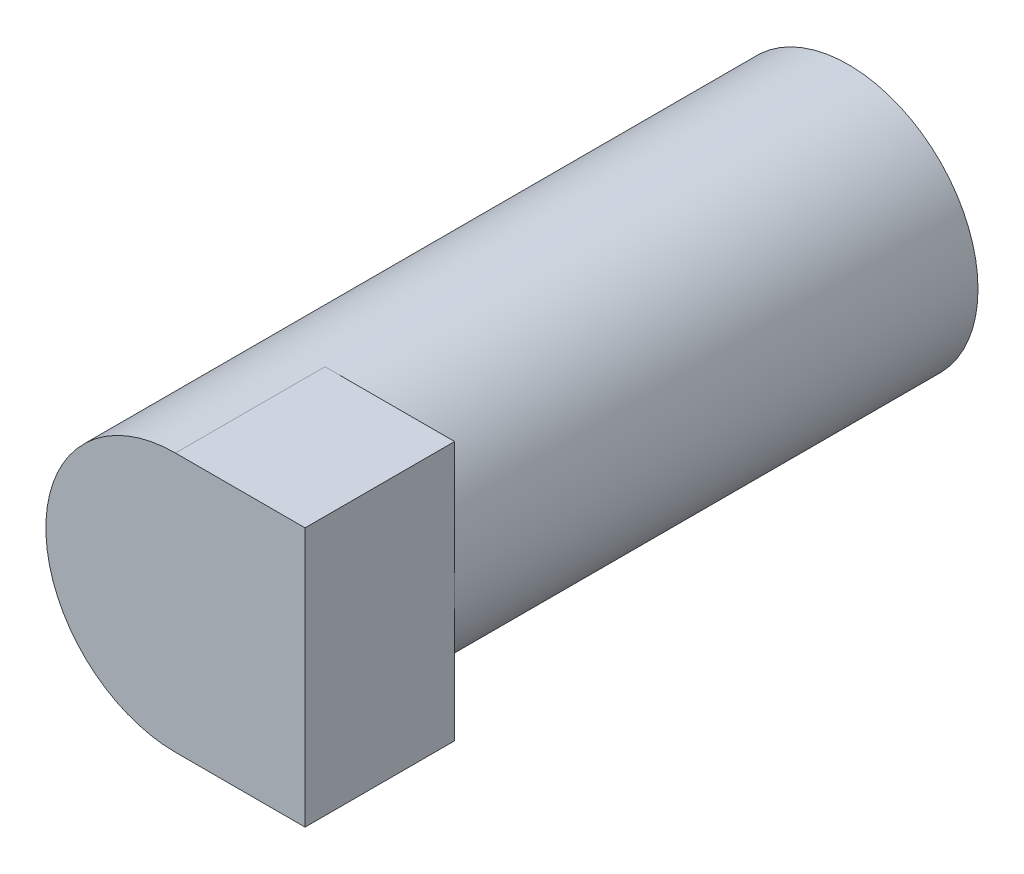
ISO-10303-21;
HEADER;
FILE_DESCRIPTION(('STEP AP214'),'2;1');
FILE_NAME('part.step','',(''),(''),'','','');
FILE_SCHEMA(('AUTOMOTIVE_DESIGN { 1 0 10303 214 1 1 1 1 }'));
ENDSEC;
DATA;
#1=APPLICATION_CONTEXT('core data for automotive mechanical design processes');
#2=APPLICATION_PROTOCOL_DEFINITION('international standard','automotive_design',2000,#1);
#3=PRODUCT_CONTEXT('',#1,'mechanical');
#4=PRODUCT('Part','Part','',(#3));
#5=PRODUCT_RELATED_PRODUCT_CATEGORY('part','',(#4));
#6=PRODUCT_DEFINITION_FORMATION('','',#4);
#7=PRODUCT_DEFINITION_CONTEXT('part definition',#1,'design');
#8=PRODUCT_DEFINITION('design','',#6,#7);
#9=PRODUCT_DEFINITION_SHAPE('','',#8);
#10=(LENGTH_UNIT() NAMED_UNIT(*) SI_UNIT(.MILLI.,.METRE.));
#11=(NAMED_UNIT(*) PLANE_ANGLE_UNIT() SI_UNIT($,.RADIAN.));
#12=(NAMED_UNIT(*) SI_UNIT($,.STERADIAN.) SOLID_ANGLE_UNIT());
#13=UNCERTAINTY_MEASURE_WITH_UNIT(LENGTH_MEASURE(1.E-05),#10,'distance_accuracy_value','');
#14=(GEOMETRIC_REPRESENTATION_CONTEXT(3) GLOBAL_UNCERTAINTY_ASSIGNED_CONTEXT((#13)) GLOBAL_UNIT_ASSIGNED_CONTEXT((#10,
#11,#12)) REPRESENTATION_CONTEXT('',''));
#15=CARTESIAN_POINT('',(0.,0.,0.));
#16=DIRECTION('',(0.,0.,1.));
#17=DIRECTION('',(1.,0.,0.));
#18=AXIS2_PLACEMENT_3D('',#15,#16,#17);
#19=CARTESIAN_POINT('',(0.,0.,67.5));
#20=DIRECTION('',(0.,0.,-1.));
#21=DIRECTION('',(-1.,0.,0.));
#22=AXIS2_PLACEMENT_3D('',#19,#20,#21);
#23=CYLINDRICAL_SURFACE('',#22,13.);
#24=CARTESIAN_POINT('',(0.,0.,0.));
#25=DIRECTION('',(0.,0.,1.));
#26=DIRECTION('',(1.,0.,0.));
#27=AXIS2_PLACEMENT_3D('',#24,#25,#26);
#28=CIRCLE('',#27,13.);
#29=CARTESIAN_POINT('',(13.,0.,0.));
#30=VERTEX_POINT('',#29);
#31=EDGE_CURVE('E108',#30,#30,#28,.T.);
#32=ORIENTED_EDGE('',*,*,#31,.T.);
#33=EDGE_LOOP('',(#32));
#34=FACE_BOUND('',#33,.T.);
#35=CARTESIAN_POINT('',(0.,0.,52.5));
#36=DIRECTION('',(0.,0.,1.));
#37=DIRECTION('',(1.,0.,0.));
#38=AXIS2_PLACEMENT_3D('',#35,#36,#37);
#39=CIRCLE('',#38,13.);
#40=CARTESIAN_POINT('',(0.,-13.,52.5));
#41=VERTEX_POINT('',#40);
#42=CARTESIAN_POINT('',(13.,0.,52.5));
#43=VERTEX_POINT('',#42);
#44=EDGE_CURVE('E12',#41,#43,#39,.T.);
#45=ORIENTED_EDGE('',*,*,#44,.F.);
#46=DIRECTION('',(0.,0.,-1.));
#47=VECTOR('',#46,1.);
#48=CARTESIAN_POINT('',(0.,-13.,67.5));
#49=LINE('',#48,#47);
#50=CARTESIAN_POINT('',(0.,-13.,67.5));
#51=VERTEX_POINT('',#50);
#52=EDGE_CURVE('E127',#51,#41,#49,.T.);
#53=ORIENTED_EDGE('',*,*,#52,.F.);
#54=CARTESIAN_POINT('',(0.,0.,67.5));
#55=DIRECTION('',(0.,0.,1.));
#56=DIRECTION('',(1.,0.,0.));
#57=AXIS2_PLACEMENT_3D('',#54,#55,#56);
#58=CIRCLE('',#57,13.);
#59=CARTESIAN_POINT('',(0.,13.,67.5));
#60=VERTEX_POINT('',#59);
#61=EDGE_CURVE('E107',#60,#51,#58,.T.);
#62=ORIENTED_EDGE('',*,*,#61,.F.);
#63=DIRECTION('',(0.,0.,1.));
#64=VECTOR('',#63,1.);
#65=CARTESIAN_POINT('',(0.,13.,67.5));
#66=LINE('',#65,#64);
#67=CARTESIAN_POINT('',(0.,13.,52.5));
#68=VERTEX_POINT('',#67);
#69=EDGE_CURVE('E95',#68,#60,#66,.T.);
#70=ORIENTED_EDGE('',*,*,#69,.F.);
#71=EDGE_CURVE('E48',#43,#68,#39,.T.);
#72=ORIENTED_EDGE('',*,*,#71,.F.);
#73=EDGE_LOOP('',(#45,#53,#62,#70,#72));
#74=FACE_BOUND('',#73,.T.);
#75=ADVANCED_FACE('F45',(#34,#74),#23,.T.);
#76=CARTESIAN_POINT('',(0.,0.,67.5));
#77=DIRECTION('',(0.,0.,1.));
#78=DIRECTION('',(1.,0.,0.));
#79=AXIS2_PLACEMENT_3D('',#76,#77,#78);
#80=PLANE('',#79);
#81=DIRECTION('',(0.,-1.,0.));
#82=VECTOR('',#81,1.);
#83=CARTESIAN_POINT('',(13.,13.,67.5));
#84=LINE('',#83,#82);
#85=CARTESIAN_POINT('',(13.,13.,67.5));
#86=VERTEX_POINT('',#85);
#87=CARTESIAN_POINT('',(13.,-13.,67.5));
#88=VERTEX_POINT('',#87);
#89=EDGE_CURVE('E82',#86,#88,#84,.T.);
#90=ORIENTED_EDGE('',*,*,#89,.F.);
#91=DIRECTION('',(-1.,0.,0.));
#92=VECTOR('',#91,1.);
#93=CARTESIAN_POINT('',(13.,13.,67.5));
#94=LINE('',#93,#92);
#95=EDGE_CURVE('E123',#86,#60,#94,.T.);
#96=ORIENTED_EDGE('',*,*,#95,.T.);
#97=ORIENTED_EDGE('',*,*,#61,.T.);
#98=DIRECTION('',(-1.,0.,0.));
#99=VECTOR('',#98,1.);
#100=CARTESIAN_POINT('',(13.,-13.,67.5));
#101=LINE('',#100,#99);
#102=EDGE_CURVE('E99',#88,#51,#101,.T.);
#103=ORIENTED_EDGE('',*,*,#102,.F.);
#104=EDGE_LOOP('',(#90,#96,#97,#103));
#105=FACE_BOUND('',#104,.T.);
#106=ADVANCED_FACE('F106',(#105),#80,.T.);
#107=CARTESIAN_POINT('',(0.,0.,0.));
#108=DIRECTION('',(0.,0.,1.));
#109=DIRECTION('',(1.,0.,0.));
#110=AXIS2_PLACEMENT_3D('',#107,#108,#109);
#111=PLANE('',#110);
#112=ORIENTED_EDGE('',*,*,#31,.F.);
#113=EDGE_LOOP('',(#112));
#114=FACE_BOUND('',#113,.T.);
#115=ADVANCED_FACE('F143',(#114),#111,.F.);
#116=CARTESIAN_POINT('',(13.,13.,52.5));
#117=DIRECTION('',(0.,0.,1.));
#118=DIRECTION('',(1.,0.,0.));
#119=AXIS2_PLACEMENT_3D('',#116,#117,#118);
#120=PLANE('',#119);
#121=DIRECTION('',(0.,1.,0.));
#122=VECTOR('',#121,1.);
#123=CARTESIAN_POINT('',(13.,13.,52.5));
#124=LINE('',#123,#122);
#125=CARTESIAN_POINT('',(13.,13.,52.5));
#126=VERTEX_POINT('',#125);
#127=EDGE_CURVE('E103',#43,#126,#124,.T.);
#128=ORIENTED_EDGE('',*,*,#127,.F.);
#129=ORIENTED_EDGE('',*,*,#71,.T.);
#130=DIRECTION('',(-1.,0.,0.));
#131=VECTOR('',#130,1.);
#132=CARTESIAN_POINT('',(13.,13.,52.5));
#133=LINE('',#132,#131);
#134=EDGE_CURVE('E111',#126,#68,#133,.T.);
#135=ORIENTED_EDGE('',*,*,#134,.F.);
#136=EDGE_LOOP('',(#128,#129,#135));
#137=FACE_BOUND('',#136,.T.);
#138=ADVANCED_FACE('F119',(#137),#120,.F.);
#139=CARTESIAN_POINT('',(13.,0.,0.));
#140=DIRECTION('',(1.,0.,0.));
#141=DIRECTION('',(0.,0.,-1.));
#142=AXIS2_PLACEMENT_3D('',#139,#140,#141);
#143=PLANE('',#142);
#144=CARTESIAN_POINT('',(13.,-13.,52.5));
#145=VERTEX_POINT('',#144);
#146=EDGE_CURVE('E130',#145,#43,#124,.T.);
#147=ORIENTED_EDGE('',*,*,#146,.T.);
#148=ORIENTED_EDGE('',*,*,#127,.T.);
#149=DIRECTION('',(0.,0.,1.));
#150=VECTOR('',#149,1.);
#151=CARTESIAN_POINT('',(13.,13.,67.5));
#152=LINE('',#151,#150);
#153=EDGE_CURVE('E89',#126,#86,#152,.T.);
#154=ORIENTED_EDGE('',*,*,#153,.T.);
#155=ORIENTED_EDGE('',*,*,#89,.T.);
#156=DIRECTION('',(0.,0.,-1.));
#157=VECTOR('',#156,1.);
#158=CARTESIAN_POINT('',(13.,-13.,67.5));
#159=LINE('',#158,#157);
#160=EDGE_CURVE('E86',#88,#145,#159,.T.);
#161=ORIENTED_EDGE('',*,*,#160,.T.);
#162=EDGE_LOOP('',(#147,#148,#154,#155,#161));
#163=FACE_BOUND('',#162,.T.);
#164=ADVANCED_FACE('F85',(#163),#143,.T.);
#165=CARTESIAN_POINT('',(13.,-13.,67.5));
#166=DIRECTION('',(0.,1.,0.));
#167=DIRECTION('',(0.,0.,1.));
#168=AXIS2_PLACEMENT_3D('',#165,#166,#167);
#169=PLANE('',#168);
#170=ORIENTED_EDGE('',*,*,#52,.T.);
#171=DIRECTION('',(-1.,0.,0.));
#172=VECTOR('',#171,1.);
#173=CARTESIAN_POINT('',(13.,-13.,52.5));
#174=LINE('',#173,#172);
#175=EDGE_CURVE('E101',#145,#41,#174,.T.);
#176=ORIENTED_EDGE('',*,*,#175,.F.);
#177=ORIENTED_EDGE('',*,*,#160,.F.);
#178=ORIENTED_EDGE('',*,*,#102,.T.);
#179=EDGE_LOOP('',(#170,#176,#177,#178));
#180=FACE_BOUND('',#179,.T.);
#181=ADVANCED_FACE('F98',(#180),#169,.F.);
#182=ORIENTED_EDGE('',*,*,#175,.T.);
#183=ORIENTED_EDGE('',*,*,#44,.T.);
#184=ORIENTED_EDGE('',*,*,#146,.F.);
#185=EDGE_LOOP('',(#182,#183,#184));
#186=FACE_BOUND('',#185,.T.);
#187=ADVANCED_FACE('F133',(#186),#120,.F.);
#188=CARTESIAN_POINT('',(13.,13.,67.5));
#189=DIRECTION('',(0.,-1.,0.));
#190=DIRECTION('',(0.,0.,-1.));
#191=AXIS2_PLACEMENT_3D('',#188,#189,#190);
#192=PLANE('',#191);
#193=ORIENTED_EDGE('',*,*,#69,.T.);
#194=ORIENTED_EDGE('',*,*,#95,.F.);
#195=ORIENTED_EDGE('',*,*,#153,.F.);
#196=ORIENTED_EDGE('',*,*,#134,.T.);
#197=EDGE_LOOP('',(#193,#194,#195,#196));
#198=FACE_BOUND('',#197,.T.);
#199=ADVANCED_FACE('F122',(#198),#192,.F.);
#200=CLOSED_SHELL('',(#75,#106,#115,#138,#164,#181,#187,#199));
#201=MANIFOLD_SOLID_BREP('B2',#200);
#202=ADVANCED_BREP_SHAPE_REPRESENTATION('',(#18,#201),#14);
#203=SHAPE_DEFINITION_REPRESENTATION(#9,#202);
ENDSEC;
END-ISO-10303-21;
